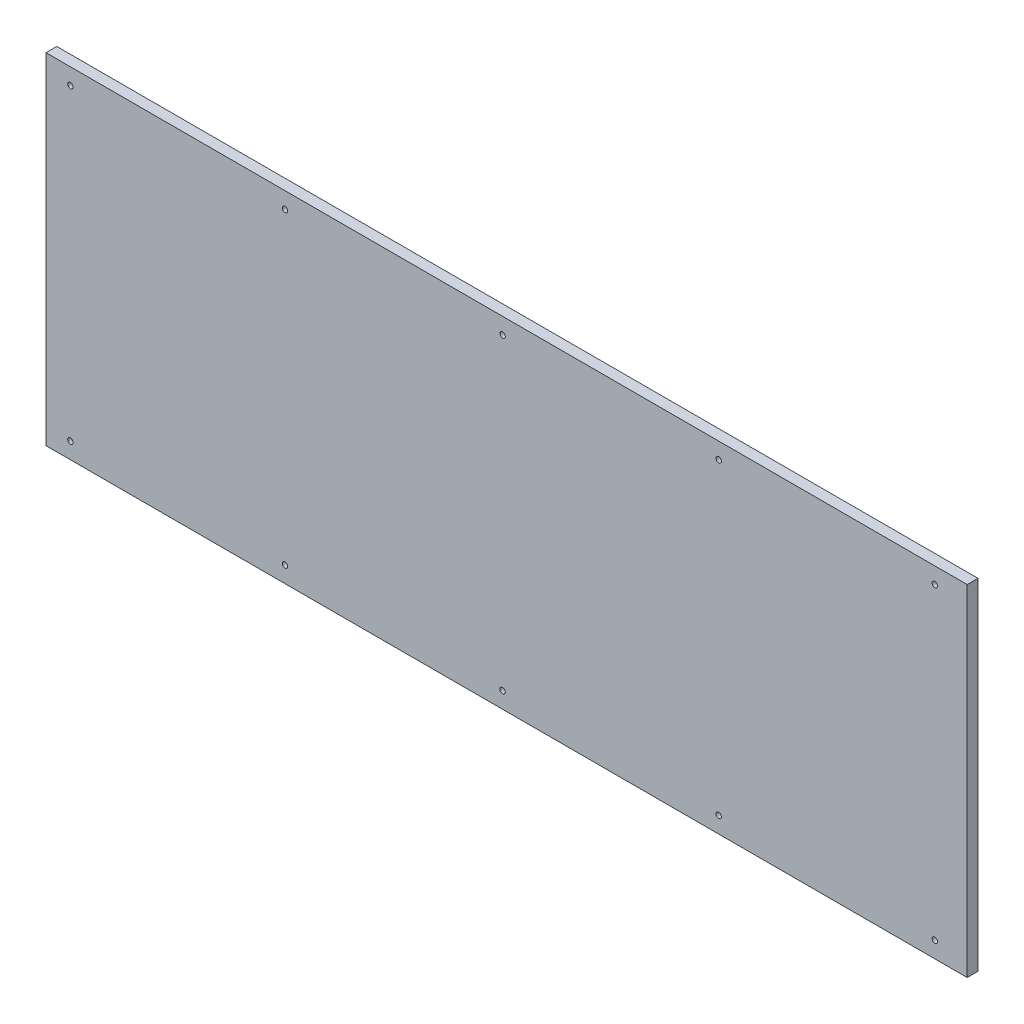
ISO-10303-21;
HEADER;
FILE_DESCRIPTION(('STEP AP214'),'2;1');
FILE_NAME('part.step','',(''),(''),'','','');
FILE_SCHEMA(('AUTOMOTIVE_DESIGN { 1 0 10303 214 1 1 1 1 }'));
ENDSEC;
DATA;
#1=APPLICATION_CONTEXT('core data for automotive mechanical design processes');
#2=APPLICATION_PROTOCOL_DEFINITION('international standard','automotive_design',2000,#1);
#3=PRODUCT_CONTEXT('',#1,'mechanical');
#4=PRODUCT('Part','Part','',(#3));
#5=PRODUCT_RELATED_PRODUCT_CATEGORY('part','',(#4));
#6=PRODUCT_DEFINITION_FORMATION('','',#4);
#7=PRODUCT_DEFINITION_CONTEXT('part definition',#1,'design');
#8=PRODUCT_DEFINITION('design','',#6,#7);
#9=PRODUCT_DEFINITION_SHAPE('','',#8);
#10=(LENGTH_UNIT() NAMED_UNIT(*) SI_UNIT(.MILLI.,.METRE.));
#11=(NAMED_UNIT(*) PLANE_ANGLE_UNIT() SI_UNIT($,.RADIAN.));
#12=(NAMED_UNIT(*) SI_UNIT($,.STERADIAN.) SOLID_ANGLE_UNIT());
#13=UNCERTAINTY_MEASURE_WITH_UNIT(LENGTH_MEASURE(1.E-05),#10,'distance_accuracy_value','');
#14=(GEOMETRIC_REPRESENTATION_CONTEXT(3) GLOBAL_UNCERTAINTY_ASSIGNED_CONTEXT((#13)) GLOBAL_UNIT_ASSIGNED_CONTEXT((#10,
#11,#12)) REPRESENTATION_CONTEXT('',''));
#15=CARTESIAN_POINT('',(0.,0.,0.));
#16=DIRECTION('',(0.,0.,1.));
#17=DIRECTION('',(1.,0.,0.));
#18=AXIS2_PLACEMENT_3D('',#15,#16,#17);
#19=CARTESIAN_POINT('',(0.,0.,12.7));
#20=DIRECTION('',(-1.,0.,0.));
#21=DIRECTION('',(0.,-1.,0.));
#22=AXIS2_PLACEMENT_3D('',#19,#20,#21);
#23=PLANE('',#22);
#24=DIRECTION('',(0.,1.,0.));
#25=VECTOR('',#24,1.);
#26=CARTESIAN_POINT('',(0.,0.,0.));
#27=LINE('',#26,#25);
#28=CARTESIAN_POINT('',(0.,0.,0.));
#29=VERTEX_POINT('',#28);
#30=CARTESIAN_POINT('',(0.,400.05,0.));
#31=VERTEX_POINT('',#30);
#32=EDGE_CURVE('E107',#29,#31,#27,.T.);
#33=ORIENTED_EDGE('',*,*,#32,.T.);
#34=DIRECTION('',(0.,0.,-1.));
#35=VECTOR('',#34,1.);
#36=CARTESIAN_POINT('',(0.,400.05,12.7));
#37=LINE('',#36,#35);
#38=CARTESIAN_POINT('',(0.,400.05,12.7));
#39=VERTEX_POINT('',#38);
#40=EDGE_CURVE('E11',#39,#31,#37,.T.);
#41=ORIENTED_EDGE('',*,*,#40,.F.);
#42=DIRECTION('',(0.,1.,0.));
#43=VECTOR('',#42,1.);
#44=CARTESIAN_POINT('',(0.,0.,12.7));
#45=LINE('',#44,#43);
#46=CARTESIAN_POINT('',(0.,0.,12.7));
#47=VERTEX_POINT('',#46);
#48=EDGE_CURVE('E91',#47,#39,#45,.T.);
#49=ORIENTED_EDGE('',*,*,#48,.F.);
#50=DIRECTION('',(0.,0.,-1.));
#51=VECTOR('',#50,1.);
#52=CARTESIAN_POINT('',(0.,0.,12.7));
#53=LINE('',#52,#51);
#54=EDGE_CURVE('E103',#47,#29,#53,.T.);
#55=ORIENTED_EDGE('',*,*,#54,.T.);
#56=EDGE_LOOP('',(#33,#41,#49,#55));
#57=FACE_BOUND('',#56,.T.);
#58=ADVANCED_FACE('F39',(#57),#23,.F.);
#59=CARTESIAN_POINT('',(0.,400.05,12.7));
#60=DIRECTION('',(0.,-1.,0.));
#61=DIRECTION('',(1.,0.,0.));
#62=AXIS2_PLACEMENT_3D('',#59,#60,#61);
#63=PLANE('',#62);
#64=DIRECTION('',(-1.,0.,0.));
#65=VECTOR('',#64,1.);
#66=CARTESIAN_POINT('',(0.,400.05,0.));
#67=LINE('',#66,#65);
#68=CARTESIAN_POINT('',(-1082.802,400.05,0.));
#69=VERTEX_POINT('',#68);
#70=EDGE_CURVE('E96',#31,#69,#67,.T.);
#71=ORIENTED_EDGE('',*,*,#70,.T.);
#72=DIRECTION('',(0.,0.,-1.));
#73=VECTOR('',#72,1.);
#74=CARTESIAN_POINT('',(-1082.802,400.05,12.7));
#75=LINE('',#74,#73);
#76=CARTESIAN_POINT('',(-1082.802,400.05,12.7));
#77=VERTEX_POINT('',#76);
#78=EDGE_CURVE('E48',#77,#69,#75,.T.);
#79=ORIENTED_EDGE('',*,*,#78,.F.);
#80=DIRECTION('',(-1.,0.,0.));
#81=VECTOR('',#80,1.);
#82=CARTESIAN_POINT('',(0.,400.05,12.7));
#83=LINE('',#82,#81);
#84=EDGE_CURVE('E86',#39,#77,#83,.T.);
#85=ORIENTED_EDGE('',*,*,#84,.F.);
#86=ORIENTED_EDGE('',*,*,#40,.T.);
#87=EDGE_LOOP('',(#71,#79,#85,#86));
#88=FACE_BOUND('',#87,.T.);
#89=ADVANCED_FACE('F95',(#88),#63,.F.);
#90=CARTESIAN_POINT('',(-1082.802,-1.32605000341035E-13,12.7));
#91=DIRECTION('',(1.,0.,0.));
#92=DIRECTION('',(0.,0.,-1.));
#93=AXIS2_PLACEMENT_3D('',#90,#91,#92);
#94=PLANE('',#93);
#95=DIRECTION('',(0.,-1.,0.));
#96=VECTOR('',#95,1.);
#97=CARTESIAN_POINT('',(-1082.802,-1.32605000341035E-13,0.));
#98=LINE('',#97,#96);
#99=CARTESIAN_POINT('',(-1082.802,-1.32605000341035E-13,0.));
#100=VERTEX_POINT('',#99);
#101=EDGE_CURVE('E73',#69,#100,#98,.T.);
#102=ORIENTED_EDGE('',*,*,#101,.T.);
#103=DIRECTION('',(0.,0.,-1.));
#104=VECTOR('',#103,1.);
#105=CARTESIAN_POINT('',(-1082.802,-1.32605000341035E-13,12.7));
#106=LINE('',#105,#104);
#107=CARTESIAN_POINT('',(-1082.802,-1.32605000341035E-13,12.7));
#108=VERTEX_POINT('',#107);
#109=EDGE_CURVE('E98',#108,#100,#106,.T.);
#110=ORIENTED_EDGE('',*,*,#109,.F.);
#111=DIRECTION('',(0.,-1.,0.));
#112=VECTOR('',#111,1.);
#113=CARTESIAN_POINT('',(-1082.802,-1.32605000341035E-13,12.7));
#114=LINE('',#113,#112);
#115=EDGE_CURVE('E89',#77,#108,#114,.T.);
#116=ORIENTED_EDGE('',*,*,#115,.F.);
#117=ORIENTED_EDGE('',*,*,#78,.T.);
#118=EDGE_LOOP('',(#102,#110,#116,#117));
#119=FACE_BOUND('',#118,.T.);
#120=ADVANCED_FACE('F99',(#119),#94,.F.);
#121=CARTESIAN_POINT('',(0.,0.,12.7));
#122=DIRECTION('',(0.,1.,0.));
#123=DIRECTION('',(-1.,0.,0.));
#124=AXIS2_PLACEMENT_3D('',#121,#122,#123);
#125=PLANE('',#124);
#126=DIRECTION('',(1.,0.,0.));
#127=VECTOR('',#126,1.);
#128=CARTESIAN_POINT('',(0.,0.,0.));
#129=LINE('',#128,#127);
#130=EDGE_CURVE('E79',#100,#29,#129,.T.);
#131=ORIENTED_EDGE('',*,*,#130,.T.);
#132=ORIENTED_EDGE('',*,*,#54,.F.);
#133=DIRECTION('',(1.,0.,0.));
#134=VECTOR('',#133,1.);
#135=CARTESIAN_POINT('',(0.,0.,12.7));
#136=LINE('',#135,#134);
#137=EDGE_CURVE('E56',#108,#47,#136,.T.);
#138=ORIENTED_EDGE('',*,*,#137,.F.);
#139=ORIENTED_EDGE('',*,*,#109,.T.);
#140=EDGE_LOOP('',(#131,#132,#138,#139));
#141=FACE_BOUND('',#140,.T.);
#142=ADVANCED_FACE('F121',(#141),#125,.F.);
#143=CARTESIAN_POINT('',(0.,0.,12.7));
#144=DIRECTION('',(0.,0.,1.));
#145=DIRECTION('',(1.,0.,0.));
#146=AXIS2_PLACEMENT_3D('',#143,#144,#145);
#147=PLANE('',#146);
#148=CARTESIAN_POINT('',(-1054.1,381.,12.7));
#149=DIRECTION('',(0.,0.,1.));
#150=DIRECTION('',(-1.,0.,0.));
#151=AXIS2_PLACEMENT_3D('',#148,#149,#150);
#152=CIRCLE('',#151,3.17499999999985);
#153=CARTESIAN_POINT('',(-1057.275,381.,12.7));
#154=VERTEX_POINT('',#153);
#155=EDGE_CURVE('E136',#154,#154,#152,.T.);
#156=ORIENTED_EDGE('',*,*,#155,.F.);
#157=EDGE_LOOP('',(#156));
#158=FACE_BOUND('',#157,.T.);
#159=CARTESIAN_POINT('',(-801.878,381.,12.7));
#160=DIRECTION('',(0.,0.,1.));
#161=DIRECTION('',(-1.,0.,0.));
#162=AXIS2_PLACEMENT_3D('',#159,#160,#161);
#163=CIRCLE('',#162,3.17499999999985);
#164=CARTESIAN_POINT('',(-805.053,381.,12.7));
#165=VERTEX_POINT('',#164);
#166=EDGE_CURVE('E144',#165,#165,#163,.T.);
#167=ORIENTED_EDGE('',*,*,#166,.F.);
#168=EDGE_LOOP('',(#167));
#169=FACE_BOUND('',#168,.T.);
#170=CARTESIAN_POINT('',(-546.1,381.,12.7));
#171=DIRECTION('',(0.,0.,1.));
#172=DIRECTION('',(-1.,0.,0.));
#173=AXIS2_PLACEMENT_3D('',#170,#171,#172);
#174=CIRCLE('',#173,3.17499999999985);
#175=CARTESIAN_POINT('',(-549.275,381.,12.7));
#176=VERTEX_POINT('',#175);
#177=EDGE_CURVE('E152',#176,#176,#174,.T.);
#178=ORIENTED_EDGE('',*,*,#177,.F.);
#179=EDGE_LOOP('',(#178));
#180=FACE_BOUND('',#179,.T.);
#181=CARTESIAN_POINT('',(-292.1,381.,12.7));
#182=DIRECTION('',(0.,0.,1.));
#183=DIRECTION('',(-1.,0.,0.));
#184=AXIS2_PLACEMENT_3D('',#181,#182,#183);
#185=CIRCLE('',#184,3.17499999999985);
#186=CARTESIAN_POINT('',(-295.275,381.,12.7));
#187=VERTEX_POINT('',#186);
#188=EDGE_CURVE('E160',#187,#187,#185,.T.);
#189=ORIENTED_EDGE('',*,*,#188,.F.);
#190=EDGE_LOOP('',(#189));
#191=FACE_BOUND('',#190,.T.);
#192=CARTESIAN_POINT('',(-38.1,381.,12.7));
#193=DIRECTION('',(0.,0.,1.));
#194=DIRECTION('',(-1.,0.,0.));
#195=AXIS2_PLACEMENT_3D('',#192,#193,#194);
#196=CIRCLE('',#195,3.17499999999989);
#197=CARTESIAN_POINT('',(-41.2749999999999,381.,12.7));
#198=VERTEX_POINT('',#197);
#199=EDGE_CURVE('E168',#198,#198,#196,.T.);
#200=ORIENTED_EDGE('',*,*,#199,.F.);
#201=EDGE_LOOP('',(#200));
#202=FACE_BOUND('',#201,.T.);
#203=CARTESIAN_POINT('',(-38.1,19.0499999999998,12.7));
#204=DIRECTION('',(0.,0.,1.));
#205=DIRECTION('',(1.,0.,0.));
#206=AXIS2_PLACEMENT_3D('',#203,#204,#205);
#207=CIRCLE('',#206,3.17499999999988);
#208=CARTESIAN_POINT('',(-34.9250000000001,19.0499999999998,12.7));
#209=VERTEX_POINT('',#208);
#210=EDGE_CURVE('E176',#209,#209,#207,.T.);
#211=ORIENTED_EDGE('',*,*,#210,.F.);
#212=EDGE_LOOP('',(#211));
#213=FACE_BOUND('',#212,.T.);
#214=CARTESIAN_POINT('',(-292.1,19.0499999999999,12.7));
#215=DIRECTION('',(0.,0.,1.));
#216=DIRECTION('',(1.,0.,0.));
#217=AXIS2_PLACEMENT_3D('',#214,#215,#216);
#218=CIRCLE('',#217,3.17499999999985);
#219=CARTESIAN_POINT('',(-288.925,19.0499999999999,12.7));
#220=VERTEX_POINT('',#219);
#221=EDGE_CURVE('E184',#220,#220,#218,.T.);
#222=ORIENTED_EDGE('',*,*,#221,.F.);
#223=EDGE_LOOP('',(#222));
#224=FACE_BOUND('',#223,.T.);
#225=CARTESIAN_POINT('',(-546.1,19.0499999999999,12.7));
#226=DIRECTION('',(0.,0.,1.));
#227=DIRECTION('',(1.,0.,0.));
#228=AXIS2_PLACEMENT_3D('',#225,#226,#227);
#229=CIRCLE('',#228,3.17499999999985);
#230=CARTESIAN_POINT('',(-542.925,19.0499999999999,12.7));
#231=VERTEX_POINT('',#230);
#232=EDGE_CURVE('E192',#231,#231,#229,.T.);
#233=ORIENTED_EDGE('',*,*,#232,.F.);
#234=EDGE_LOOP('',(#233));
#235=FACE_BOUND('',#234,.T.);
#236=CARTESIAN_POINT('',(-801.878,19.0499999999999,12.7));
#237=DIRECTION('',(0.,0.,1.));
#238=DIRECTION('',(1.,0.,0.));
#239=AXIS2_PLACEMENT_3D('',#236,#237,#238);
#240=CIRCLE('',#239,3.17499999999985);
#241=CARTESIAN_POINT('',(-798.703,19.0499999999999,12.7));
#242=VERTEX_POINT('',#241);
#243=EDGE_CURVE('E200',#242,#242,#240,.T.);
#244=ORIENTED_EDGE('',*,*,#243,.F.);
#245=EDGE_LOOP('',(#244));
#246=FACE_BOUND('',#245,.T.);
#247=CARTESIAN_POINT('',(-1054.1,19.0499999999999,12.7));
#248=DIRECTION('',(0.,0.,1.));
#249=DIRECTION('',(1.,0.,0.));
#250=AXIS2_PLACEMENT_3D('',#247,#248,#249);
#251=CIRCLE('',#250,3.17499999999986);
#252=CARTESIAN_POINT('',(-1050.925,19.0499999999999,12.7));
#253=VERTEX_POINT('',#252);
#254=EDGE_CURVE('E128',#253,#253,#251,.T.);
#255=ORIENTED_EDGE('',*,*,#254,.F.);
#256=EDGE_LOOP('',(#255));
#257=FACE_BOUND('',#256,.T.);
#258=ORIENTED_EDGE('',*,*,#48,.T.);
#259=ORIENTED_EDGE('',*,*,#84,.T.);
#260=ORIENTED_EDGE('',*,*,#115,.T.);
#261=ORIENTED_EDGE('',*,*,#137,.T.);
#262=EDGE_LOOP('',(#258,#259,#260,#261));
#263=FACE_BOUND('',#262,.T.);
#264=ADVANCED_FACE('F87',(#158,#169,#180,#191,#202,#213,#224,#235,#246,#257,#263),#147,.T.);
#265=CARTESIAN_POINT('',(0.,0.,0.));
#266=DIRECTION('',(0.,0.,1.));
#267=DIRECTION('',(1.,0.,0.));
#268=AXIS2_PLACEMENT_3D('',#265,#266,#267);
#269=PLANE('',#268);
#270=CARTESIAN_POINT('',(-1054.1,381.,0.));
#271=DIRECTION('',(0.,0.,1.));
#272=DIRECTION('',(-1.,0.,0.));
#273=AXIS2_PLACEMENT_3D('',#270,#271,#272);
#274=CIRCLE('',#273,3.17499999999985);
#275=CARTESIAN_POINT('',(-1057.275,381.,0.));
#276=VERTEX_POINT('',#275);
#277=EDGE_CURVE('E140',#276,#276,#274,.T.);
#278=ORIENTED_EDGE('',*,*,#277,.T.);
#279=EDGE_LOOP('',(#278));
#280=FACE_BOUND('',#279,.T.);
#281=CARTESIAN_POINT('',(-801.878,381.,0.));
#282=DIRECTION('',(0.,0.,1.));
#283=DIRECTION('',(-1.,0.,0.));
#284=AXIS2_PLACEMENT_3D('',#281,#282,#283);
#285=CIRCLE('',#284,3.17499999999985);
#286=CARTESIAN_POINT('',(-805.053,381.,0.));
#287=VERTEX_POINT('',#286);
#288=EDGE_CURVE('E148',#287,#287,#285,.T.);
#289=ORIENTED_EDGE('',*,*,#288,.T.);
#290=EDGE_LOOP('',(#289));
#291=FACE_BOUND('',#290,.T.);
#292=CARTESIAN_POINT('',(-546.1,381.,0.));
#293=DIRECTION('',(0.,0.,1.));
#294=DIRECTION('',(-1.,0.,0.));
#295=AXIS2_PLACEMENT_3D('',#292,#293,#294);
#296=CIRCLE('',#295,3.17499999999985);
#297=CARTESIAN_POINT('',(-549.275,381.,0.));
#298=VERTEX_POINT('',#297);
#299=EDGE_CURVE('E156',#298,#298,#296,.T.);
#300=ORIENTED_EDGE('',*,*,#299,.T.);
#301=EDGE_LOOP('',(#300));
#302=FACE_BOUND('',#301,.T.);
#303=CARTESIAN_POINT('',(-292.1,381.,0.));
#304=DIRECTION('',(0.,0.,1.));
#305=DIRECTION('',(-1.,0.,0.));
#306=AXIS2_PLACEMENT_3D('',#303,#304,#305);
#307=CIRCLE('',#306,3.17499999999985);
#308=CARTESIAN_POINT('',(-295.275,381.,0.));
#309=VERTEX_POINT('',#308);
#310=EDGE_CURVE('E164',#309,#309,#307,.T.);
#311=ORIENTED_EDGE('',*,*,#310,.T.);
#312=EDGE_LOOP('',(#311));
#313=FACE_BOUND('',#312,.T.);
#314=CARTESIAN_POINT('',(-38.1,381.,0.));
#315=DIRECTION('',(0.,0.,1.));
#316=DIRECTION('',(-1.,0.,0.));
#317=AXIS2_PLACEMENT_3D('',#314,#315,#316);
#318=CIRCLE('',#317,3.17499999999989);
#319=CARTESIAN_POINT('',(-41.2749999999999,381.,0.));
#320=VERTEX_POINT('',#319);
#321=EDGE_CURVE('E172',#320,#320,#318,.T.);
#322=ORIENTED_EDGE('',*,*,#321,.T.);
#323=EDGE_LOOP('',(#322));
#324=FACE_BOUND('',#323,.T.);
#325=CARTESIAN_POINT('',(-38.1,19.0499999999998,0.));
#326=DIRECTION('',(0.,0.,1.));
#327=DIRECTION('',(1.,0.,0.));
#328=AXIS2_PLACEMENT_3D('',#325,#326,#327);
#329=CIRCLE('',#328,3.17499999999988);
#330=CARTESIAN_POINT('',(-34.9250000000001,19.0499999999998,0.));
#331=VERTEX_POINT('',#330);
#332=EDGE_CURVE('E180',#331,#331,#329,.T.);
#333=ORIENTED_EDGE('',*,*,#332,.T.);
#334=EDGE_LOOP('',(#333));
#335=FACE_BOUND('',#334,.T.);
#336=CARTESIAN_POINT('',(-292.1,19.0499999999999,0.));
#337=DIRECTION('',(0.,0.,1.));
#338=DIRECTION('',(1.,0.,0.));
#339=AXIS2_PLACEMENT_3D('',#336,#337,#338);
#340=CIRCLE('',#339,3.17499999999985);
#341=CARTESIAN_POINT('',(-288.925,19.0499999999999,0.));
#342=VERTEX_POINT('',#341);
#343=EDGE_CURVE('E188',#342,#342,#340,.T.);
#344=ORIENTED_EDGE('',*,*,#343,.T.);
#345=EDGE_LOOP('',(#344));
#346=FACE_BOUND('',#345,.T.);
#347=CARTESIAN_POINT('',(-546.1,19.0499999999999,0.));
#348=DIRECTION('',(0.,0.,1.));
#349=DIRECTION('',(1.,0.,0.));
#350=AXIS2_PLACEMENT_3D('',#347,#348,#349);
#351=CIRCLE('',#350,3.17499999999985);
#352=CARTESIAN_POINT('',(-542.925,19.0499999999999,0.));
#353=VERTEX_POINT('',#352);
#354=EDGE_CURVE('E196',#353,#353,#351,.T.);
#355=ORIENTED_EDGE('',*,*,#354,.T.);
#356=EDGE_LOOP('',(#355));
#357=FACE_BOUND('',#356,.T.);
#358=CARTESIAN_POINT('',(-801.878,19.0499999999999,0.));
#359=DIRECTION('',(0.,0.,1.));
#360=DIRECTION('',(1.,0.,0.));
#361=AXIS2_PLACEMENT_3D('',#358,#359,#360);
#362=CIRCLE('',#361,3.17499999999985);
#363=CARTESIAN_POINT('',(-798.703,19.0499999999999,0.));
#364=VERTEX_POINT('',#363);
#365=EDGE_CURVE('E132',#364,#364,#362,.T.);
#366=ORIENTED_EDGE('',*,*,#365,.T.);
#367=EDGE_LOOP('',(#366));
#368=FACE_BOUND('',#367,.T.);
#369=CARTESIAN_POINT('',(-1054.1,19.0499999999999,0.));
#370=DIRECTION('',(0.,0.,1.));
#371=DIRECTION('',(1.,0.,0.));
#372=AXIS2_PLACEMENT_3D('',#369,#370,#371);
#373=CIRCLE('',#372,3.17499999999986);
#374=CARTESIAN_POINT('',(-1050.925,19.0499999999999,0.));
#375=VERTEX_POINT('',#374);
#376=EDGE_CURVE('E111',#375,#375,#373,.T.);
#377=ORIENTED_EDGE('',*,*,#376,.T.);
#378=EDGE_LOOP('',(#377));
#379=FACE_BOUND('',#378,.T.);
#380=ORIENTED_EDGE('',*,*,#32,.F.);
#381=ORIENTED_EDGE('',*,*,#130,.F.);
#382=ORIENTED_EDGE('',*,*,#101,.F.);
#383=ORIENTED_EDGE('',*,*,#70,.F.);
#384=EDGE_LOOP('',(#380,#381,#382,#383));
#385=FACE_BOUND('',#384,.T.);
#386=ADVANCED_FACE('F124',(#280,#291,#302,#313,#324,#335,#346,#357,#368,#379,#385),#269,.F.);
#387=CARTESIAN_POINT('',(-1054.1,19.0499999999999,0.));
#388=DIRECTION('',(0.,0.,1.));
#389=DIRECTION('',(1.,0.,0.));
#390=AXIS2_PLACEMENT_3D('',#387,#388,#389);
#391=CYLINDRICAL_SURFACE('',#390,3.17499999999986);
#392=ORIENTED_EDGE('',*,*,#376,.F.);
#393=EDGE_LOOP('',(#392));
#394=FACE_BOUND('',#393,.T.);
#395=ORIENTED_EDGE('',*,*,#254,.T.);
#396=EDGE_LOOP('',(#395));
#397=FACE_BOUND('',#396,.T.);
#398=ADVANCED_FACE('F214',(#394,#397),#391,.F.);
#399=CARTESIAN_POINT('',(-801.878,19.0499999999999,0.));
#400=DIRECTION('',(0.,0.,1.));
#401=DIRECTION('',(1.,0.,0.));
#402=AXIS2_PLACEMENT_3D('',#399,#400,#401);
#403=CYLINDRICAL_SURFACE('',#402,3.17499999999985);
#404=ORIENTED_EDGE('',*,*,#365,.F.);
#405=EDGE_LOOP('',(#404));
#406=FACE_BOUND('',#405,.T.);
#407=ORIENTED_EDGE('',*,*,#243,.T.);
#408=EDGE_LOOP('',(#407));
#409=FACE_BOUND('',#408,.T.);
#410=ADVANCED_FACE('F210',(#406,#409),#403,.F.);
#411=CARTESIAN_POINT('',(-546.1,19.0499999999999,0.));
#412=DIRECTION('',(0.,0.,1.));
#413=DIRECTION('',(1.,0.,0.));
#414=AXIS2_PLACEMENT_3D('',#411,#412,#413);
#415=CYLINDRICAL_SURFACE('',#414,3.17499999999985);
#416=ORIENTED_EDGE('',*,*,#354,.F.);
#417=EDGE_LOOP('',(#416));
#418=FACE_BOUND('',#417,.T.);
#419=ORIENTED_EDGE('',*,*,#232,.T.);
#420=EDGE_LOOP('',(#419));
#421=FACE_BOUND('',#420,.T.);
#422=ADVANCED_FACE('F213',(#418,#421),#415,.F.);
#423=CARTESIAN_POINT('',(-292.1,19.0499999999999,0.));
#424=DIRECTION('',(0.,0.,1.));
#425=DIRECTION('',(1.,0.,0.));
#426=AXIS2_PLACEMENT_3D('',#423,#424,#425);
#427=CYLINDRICAL_SURFACE('',#426,3.17499999999985);
#428=ORIENTED_EDGE('',*,*,#343,.F.);
#429=EDGE_LOOP('',(#428));
#430=FACE_BOUND('',#429,.T.);
#431=ORIENTED_EDGE('',*,*,#221,.T.);
#432=EDGE_LOOP('',(#431));
#433=FACE_BOUND('',#432,.T.);
#434=ADVANCED_FACE('F275',(#430,#433),#427,.F.);
#435=CARTESIAN_POINT('',(-38.1,19.0499999999998,0.));
#436=DIRECTION('',(0.,0.,1.));
#437=DIRECTION('',(1.,0.,0.));
#438=AXIS2_PLACEMENT_3D('',#435,#436,#437);
#439=CYLINDRICAL_SURFACE('',#438,3.17499999999988);
#440=ORIENTED_EDGE('',*,*,#332,.F.);
#441=EDGE_LOOP('',(#440));
#442=FACE_BOUND('',#441,.T.);
#443=ORIENTED_EDGE('',*,*,#210,.T.);
#444=EDGE_LOOP('',(#443));
#445=FACE_BOUND('',#444,.T.);
#446=ADVANCED_FACE('F285',(#442,#445),#439,.F.);
#447=CARTESIAN_POINT('',(-38.1,381.,0.));
#448=DIRECTION('',(0.,0.,1.));
#449=DIRECTION('',(1.,0.,0.));
#450=AXIS2_PLACEMENT_3D('',#447,#448,#449);
#451=CYLINDRICAL_SURFACE('',#450,3.17499999999989);
#452=ORIENTED_EDGE('',*,*,#321,.F.);
#453=EDGE_LOOP('',(#452));
#454=FACE_BOUND('',#453,.T.);
#455=ORIENTED_EDGE('',*,*,#199,.T.);
#456=EDGE_LOOP('',(#455));
#457=FACE_BOUND('',#456,.T.);
#458=ADVANCED_FACE('F295',(#454,#457),#451,.F.);
#459=CARTESIAN_POINT('',(-292.1,381.,0.));
#460=DIRECTION('',(0.,0.,1.));
#461=DIRECTION('',(1.,0.,0.));
#462=AXIS2_PLACEMENT_3D('',#459,#460,#461);
#463=CYLINDRICAL_SURFACE('',#462,3.17499999999985);
#464=ORIENTED_EDGE('',*,*,#310,.F.);
#465=EDGE_LOOP('',(#464));
#466=FACE_BOUND('',#465,.T.);
#467=ORIENTED_EDGE('',*,*,#188,.T.);
#468=EDGE_LOOP('',(#467));
#469=FACE_BOUND('',#468,.T.);
#470=ADVANCED_FACE('F305',(#466,#469),#463,.F.);
#471=CARTESIAN_POINT('',(-546.1,381.,0.));
#472=DIRECTION('',(0.,0.,1.));
#473=DIRECTION('',(1.,0.,0.));
#474=AXIS2_PLACEMENT_3D('',#471,#472,#473);
#475=CYLINDRICAL_SURFACE('',#474,3.17499999999985);
#476=ORIENTED_EDGE('',*,*,#299,.F.);
#477=EDGE_LOOP('',(#476));
#478=FACE_BOUND('',#477,.T.);
#479=ORIENTED_EDGE('',*,*,#177,.T.);
#480=EDGE_LOOP('',(#479));
#481=FACE_BOUND('',#480,.T.);
#482=ADVANCED_FACE('F315',(#478,#481),#475,.F.);
#483=CARTESIAN_POINT('',(-801.878,381.,0.));
#484=DIRECTION('',(0.,0.,1.));
#485=DIRECTION('',(1.,0.,0.));
#486=AXIS2_PLACEMENT_3D('',#483,#484,#485);
#487=CYLINDRICAL_SURFACE('',#486,3.17499999999985);
#488=ORIENTED_EDGE('',*,*,#288,.F.);
#489=EDGE_LOOP('',(#488));
#490=FACE_BOUND('',#489,.T.);
#491=ORIENTED_EDGE('',*,*,#166,.T.);
#492=EDGE_LOOP('',(#491));
#493=FACE_BOUND('',#492,.T.);
#494=ADVANCED_FACE('F325',(#490,#493),#487,.F.);
#495=CARTESIAN_POINT('',(-1054.1,381.,0.));
#496=DIRECTION('',(0.,0.,1.));
#497=DIRECTION('',(1.,0.,0.));
#498=AXIS2_PLACEMENT_3D('',#495,#496,#497);
#499=CYLINDRICAL_SURFACE('',#498,3.17499999999985);
#500=ORIENTED_EDGE('',*,*,#277,.F.);
#501=EDGE_LOOP('',(#500));
#502=FACE_BOUND('',#501,.T.);
#503=ORIENTED_EDGE('',*,*,#155,.T.);
#504=EDGE_LOOP('',(#503));
#505=FACE_BOUND('',#504,.T.);
#506=ADVANCED_FACE('F335',(#502,#505),#499,.F.);
#507=CLOSED_SHELL('',(#58,#89,#120,#142,#264,#386,#398,#410,#422,#434,#446,#458,#470,#482,#494,#506));
#508=MANIFOLD_SOLID_BREP('B2',#507);
#509=ADVANCED_BREP_SHAPE_REPRESENTATION('',(#18,#508),#14);
#510=SHAPE_DEFINITION_REPRESENTATION(#9,#509);
ENDSEC;
END-ISO-10303-21;
